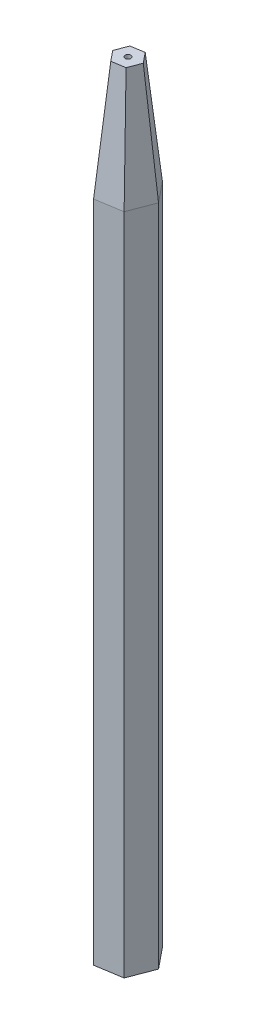
ISO-10303-21;
HEADER;
FILE_DESCRIPTION(('STEP AP214'),'2;1');
FILE_NAME('part.step','',(''),(''),'','','');
FILE_SCHEMA(('AUTOMOTIVE_DESIGN { 1 0 10303 214 1 1 1 1 }'));
ENDSEC;
DATA;
#1=APPLICATION_CONTEXT('core data for automotive mechanical design processes');
#2=APPLICATION_PROTOCOL_DEFINITION('international standard','automotive_design',2000,#1);
#3=PRODUCT_CONTEXT('',#1,'mechanical');
#4=PRODUCT('Part','Part','',(#3));
#5=PRODUCT_RELATED_PRODUCT_CATEGORY('part','',(#4));
#6=PRODUCT_DEFINITION_FORMATION('','',#4);
#7=PRODUCT_DEFINITION_CONTEXT('part definition',#1,'design');
#8=PRODUCT_DEFINITION('design','',#6,#7);
#9=PRODUCT_DEFINITION_SHAPE('','',#8);
#10=(LENGTH_UNIT() NAMED_UNIT(*) SI_UNIT(.MILLI.,.METRE.));
#11=(NAMED_UNIT(*) PLANE_ANGLE_UNIT() SI_UNIT($,.RADIAN.));
#12=(NAMED_UNIT(*) SI_UNIT($,.STERADIAN.) SOLID_ANGLE_UNIT());
#13=UNCERTAINTY_MEASURE_WITH_UNIT(LENGTH_MEASURE(1.E-05),#10,'distance_accuracy_value','');
#14=(GEOMETRIC_REPRESENTATION_CONTEXT(3) GLOBAL_UNCERTAINTY_ASSIGNED_CONTEXT((#13)) GLOBAL_UNIT_ASSIGNED_CONTEXT((#10,
#11,#12)) REPRESENTATION_CONTEXT('',''));
#15=CARTESIAN_POINT('',(0.,0.,0.));
#16=DIRECTION('',(0.,0.,1.));
#17=DIRECTION('',(1.,0.,0.));
#18=AXIS2_PLACEMENT_3D('',#15,#16,#17);
#19=CARTESIAN_POINT('',(0.,135.,0.));
#20=DIRECTION('',(0.,1.,0.));
#21=DIRECTION('',(0.,0.,1.));
#22=AXIS2_PLACEMENT_3D('',#19,#20,#21);
#23=PLANE('',#22);
#24=DIRECTION('',(-0.356838127786204,0.,0.93416623282906));
#25=VECTOR('',#24,1.);
#26=CARTESIAN_POINT('',(-2.69241482219606,135.,1.44368824839446));
#27=LINE('',#26,#25);
#28=CARTESIAN_POINT('',(-1.45629128738914,135.,-1.79235850755584));
#29=VERTEX_POINT('',#28);
#30=CARTESIAN_POINT('',(-2.28037364392709,135.,0.365005996411023));
#31=VERTEX_POINT('',#30);
#32=EDGE_CURVE('E163',#29,#31,#27,.T.);
#33=ORIENTED_EDGE('',*,*,#32,.T.);
#34=DIRECTION('',(0.630592625094472,0.,0.77611400011626));
#35=VECTOR('',#34,1.);
#36=CARTESIAN_POINT('',(-0.0959367128433723,135.,3.05354375774478));
#37=LINE('',#36,#35);
#38=CARTESIAN_POINT('',(-0.824082356537946,135.,2.15736450396686));
#39=VERTEX_POINT('',#38);
#40=EDGE_CURVE('E165',#31,#39,#37,.T.);
#41=ORIENTED_EDGE('',*,*,#40,.T.);
#42=DIRECTION('',(0.987430752880676,0.,-0.158052232712799));
#43=VECTOR('',#42,1.);
#44=CARTESIAN_POINT('',(2.59647810935269,135.,1.60985550935033));
#45=LINE('',#44,#43);
#46=CARTESIAN_POINT('',(1.45629128738914,135.,1.79235850755584));
#47=VERTEX_POINT('',#46);
#48=EDGE_CURVE('E115',#39,#47,#45,.T.);
#49=ORIENTED_EDGE('',*,*,#48,.T.);
#50=DIRECTION('',(0.356838127786204,0.,-0.93416623282906));
#51=VECTOR('',#50,1.);
#52=CARTESIAN_POINT('',(2.69241482219606,135.,-1.44368824839446));
#53=LINE('',#52,#51);
#54=CARTESIAN_POINT('',(2.28037364392709,135.,-0.365005996411024));
#55=VERTEX_POINT('',#54);
#56=EDGE_CURVE('E157',#47,#55,#53,.T.);
#57=ORIENTED_EDGE('',*,*,#56,.T.);
#58=DIRECTION('',(-0.630592625094472,0.,-0.77611400011626));
#59=VECTOR('',#58,1.);
#60=CARTESIAN_POINT('',(0.0959367128433741,135.,-3.05354375774478));
#61=LINE('',#60,#59);
#62=CARTESIAN_POINT('',(0.824082356537947,135.,-2.15736450396686));
#63=VERTEX_POINT('',#62);
#64=EDGE_CURVE('E159',#55,#63,#61,.T.);
#65=ORIENTED_EDGE('',*,*,#64,.T.);
#66=DIRECTION('',(-0.987430752880676,0.,0.158052232712799));
#67=VECTOR('',#66,1.);
#68=CARTESIAN_POINT('',(-2.59647810935269,135.,-1.60985550935033));
#69=LINE('',#68,#67);
#70=EDGE_CURVE('E161',#63,#29,#69,.T.);
#71=ORIENTED_EDGE('',*,*,#70,.T.);
#72=EDGE_LOOP('',(#33,#41,#49,#57,#65,#71));
#73=FACE_BOUND('',#72,.T.);
#74=CARTESIAN_POINT('',(0.,135.,0.));
#75=DIRECTION('',(0.,1.,0.));
#76=DIRECTION('',(0.,0.,1.));
#77=AXIS2_PLACEMENT_3D('',#74,#75,#76);
#78=CIRCLE('',#77,0.5);
#79=CARTESIAN_POINT('',(0.,135.,0.5));
#80=VERTEX_POINT('',#79);
#81=EDGE_CURVE('E132',#80,#80,#78,.T.);
#82=ORIENTED_EDGE('',*,*,#81,.F.);
#83=EDGE_LOOP('',(#82));
#84=FACE_BOUND('',#83,.T.);
#85=ADVANCED_FACE('F36',(#73,#84),#23,.T.);
#86=CARTESIAN_POINT('',(0.,0.,0.));
#87=DIRECTION('',(0.,1.,0.));
#88=DIRECTION('',(0.,0.,1.));
#89=AXIS2_PLACEMENT_3D('',#86,#87,#88);
#90=PLANE('',#89);
#91=DIRECTION('',(0.987430752880676,0.,-0.158052232712799));
#92=VECTOR('',#91,1.);
#93=CARTESIAN_POINT('',(-1.64816471307589,0.,4.31472900793373));
#94=LINE('',#93,#92);
#95=CARTESIAN_POINT('',(-1.64816471307589,0.,4.31472900793373));
#96=VERTEX_POINT('',#95);
#97=CARTESIAN_POINT('',(2.91258257477829,0.,3.58471701511168));
#98=VERTEX_POINT('',#97);
#99=EDGE_CURVE('E123',#96,#98,#94,.T.);
#100=ORIENTED_EDGE('',*,*,#99,.F.);
#101=DIRECTION('',(0.630592625094472,0.,0.77611400011626));
#102=VECTOR('',#101,1.);
#103=CARTESIAN_POINT('',(-4.56074728785418,0.,0.730011992822048));
#104=LINE('',#103,#102);
#105=CARTESIAN_POINT('',(-4.56074728785418,0.,0.730011992822048));
#106=VERTEX_POINT('',#105);
#107=EDGE_CURVE('E146',#106,#96,#104,.T.);
#108=ORIENTED_EDGE('',*,*,#107,.F.);
#109=DIRECTION('',(-0.356838127786204,0.,0.93416623282906));
#110=VECTOR('',#109,1.);
#111=CARTESIAN_POINT('',(-2.91258257477829,0.,-3.58471701511168));
#112=LINE('',#111,#110);
#113=CARTESIAN_POINT('',(-2.91258257477829,0.,-3.58471701511168));
#114=VERTEX_POINT('',#113);
#115=EDGE_CURVE('E143',#114,#106,#112,.T.);
#116=ORIENTED_EDGE('',*,*,#115,.F.);
#117=DIRECTION('',(-0.987430752880676,0.,0.158052232712799));
#118=VECTOR('',#117,1.);
#119=CARTESIAN_POINT('',(1.6481647130759,0.,-4.31472900793373));
#120=LINE('',#119,#118);
#121=CARTESIAN_POINT('',(1.6481647130759,0.,-4.31472900793373));
#122=VERTEX_POINT('',#121);
#123=EDGE_CURVE('E140',#122,#114,#120,.T.);
#124=ORIENTED_EDGE('',*,*,#123,.F.);
#125=DIRECTION('',(-0.630592625094472,0.,-0.77611400011626));
#126=VECTOR('',#125,1.);
#127=CARTESIAN_POINT('',(4.56074728785418,0.,-0.730011992822049));
#128=LINE('',#127,#126);
#129=CARTESIAN_POINT('',(4.56074728785418,0.,-0.730011992822049));
#130=VERTEX_POINT('',#129);
#131=EDGE_CURVE('E126',#130,#122,#128,.T.);
#132=ORIENTED_EDGE('',*,*,#131,.F.);
#133=DIRECTION('',(0.356838127786204,0.,-0.93416623282906));
#134=VECTOR('',#133,1.);
#135=CARTESIAN_POINT('',(2.91258257477829,0.,3.58471701511168));
#136=LINE('',#135,#134);
#137=EDGE_CURVE('E110',#98,#130,#136,.T.);
#138=ORIENTED_EDGE('',*,*,#137,.F.);
#139=EDGE_LOOP('',(#100,#108,#116,#124,#132,#138));
#140=FACE_BOUND('',#139,.T.);
#141=CARTESIAN_POINT('',(0.,0.,0.));
#142=DIRECTION('',(0.,1.,0.));
#143=DIRECTION('',(0.,0.,1.));
#144=AXIS2_PLACEMENT_3D('',#141,#142,#143);
#145=CIRCLE('',#144,0.5);
#146=CARTESIAN_POINT('',(0.,0.,0.5));
#147=VERTEX_POINT('',#146);
#148=EDGE_CURVE('E135',#147,#147,#145,.T.);
#149=ORIENTED_EDGE('',*,*,#148,.T.);
#150=EDGE_LOOP('',(#149));
#151=FACE_BOUND('',#150,.T.);
#152=ADVANCED_FACE('F120',(#140,#151),#90,.F.);
#153=CARTESIAN_POINT('',(-1.64816471307589,135.,4.31472900793373));
#154=DIRECTION('',(-0.158052232712799,0.,-0.987430752880676));
#155=DIRECTION('',(-0.987430752880676,0.,0.158052232712799));
#156=AXIS2_PLACEMENT_3D('',#153,#154,#155);
#157=PLANE('',#156);
#158=DIRECTION('',(0.,-1.,0.));
#159=VECTOR('',#158,1.);
#160=CARTESIAN_POINT('',(2.91258257477829,135.,3.58471701511168));
#161=LINE('',#160,#159);
#162=CARTESIAN_POINT('',(2.91258257477829,114.999999999999,3.58471701511168));
#163=VERTEX_POINT('',#162);
#164=EDGE_CURVE('E107',#163,#98,#161,.T.);
#165=ORIENTED_EDGE('',*,*,#164,.F.);
#166=DIRECTION('',(-0.987430752880676,0.,0.158052232712799));
#167=VECTOR('',#166,1.);
#168=CARTESIAN_POINT('',(-1.64816471307589,114.999999999999,4.31472900793373));
#169=LINE('',#168,#167);
#170=CARTESIAN_POINT('',(-1.64816471307589,114.999999999999,4.31472900793373));
#171=VERTEX_POINT('',#170);
#172=EDGE_CURVE('E11',#163,#171,#169,.T.);
#173=ORIENTED_EDGE('',*,*,#172,.T.);
#174=DIRECTION('',(0.,-1.,0.));
#175=VECTOR('',#174,1.);
#176=CARTESIAN_POINT('',(-1.64816471307589,135.,4.31472900793373));
#177=LINE('',#176,#175);
#178=EDGE_CURVE('E130',#171,#96,#177,.T.);
#179=ORIENTED_EDGE('',*,*,#178,.T.);
#180=ORIENTED_EDGE('',*,*,#99,.T.);
#181=EDGE_LOOP('',(#165,#173,#179,#180));
#182=FACE_BOUND('',#181,.T.);
#183=ADVANCED_FACE('F128',(#182),#157,.F.);
#184=CARTESIAN_POINT('',(2.91258257477829,135.,3.58471701511168));
#185=DIRECTION('',(-0.93416623282906,0.,-0.356838127786204));
#186=DIRECTION('',(-0.356838127786204,0.,0.93416623282906));
#187=AXIS2_PLACEMENT_3D('',#184,#185,#186);
#188=PLANE('',#187);
#189=DIRECTION('',(0.,-1.,0.));
#190=VECTOR('',#189,1.);
#191=CARTESIAN_POINT('',(4.56074728785418,135.,-0.730011992822049));
#192=LINE('',#191,#190);
#193=CARTESIAN_POINT('',(4.56074728785418,114.999999999999,-0.730011992822049));
#194=VERTEX_POINT('',#193);
#195=EDGE_CURVE('E116',#194,#130,#192,.T.);
#196=ORIENTED_EDGE('',*,*,#195,.F.);
#197=DIRECTION('',(-0.356838127786204,0.,0.93416623282906));
#198=VECTOR('',#197,1.);
#199=CARTESIAN_POINT('',(2.91258257477829,114.999999999999,3.58471701511168));
#200=LINE('',#199,#198);
#201=EDGE_CURVE('E46',#194,#163,#200,.T.);
#202=ORIENTED_EDGE('',*,*,#201,.T.);
#203=ORIENTED_EDGE('',*,*,#164,.T.);
#204=ORIENTED_EDGE('',*,*,#137,.T.);
#205=EDGE_LOOP('',(#196,#202,#203,#204));
#206=FACE_BOUND('',#205,.T.);
#207=ADVANCED_FACE('F109',(#206),#188,.F.);
#208=CARTESIAN_POINT('',(4.56074728785418,135.,-0.730011992822049));
#209=DIRECTION('',(-0.77611400011626,0.,0.630592625094472));
#210=DIRECTION('',(0.630592625094472,0.,0.77611400011626));
#211=AXIS2_PLACEMENT_3D('',#208,#209,#210);
#212=PLANE('',#211);
#213=DIRECTION('',(0.,-1.,0.));
#214=VECTOR('',#213,1.);
#215=CARTESIAN_POINT('',(1.6481647130759,135.,-4.31472900793373));
#216=LINE('',#215,#214);
#217=CARTESIAN_POINT('',(1.6481647130759,114.999999999999,-4.31472900793373));
#218=VERTEX_POINT('',#217);
#219=EDGE_CURVE('E153',#218,#122,#216,.T.);
#220=ORIENTED_EDGE('',*,*,#219,.F.);
#221=DIRECTION('',(0.630592625094472,0.,0.77611400011626));
#222=VECTOR('',#221,1.);
#223=CARTESIAN_POINT('',(4.56074728785418,114.999999999999,-0.730011992822049));
#224=LINE('',#223,#222);
#225=EDGE_CURVE('E61',#218,#194,#224,.T.);
#226=ORIENTED_EDGE('',*,*,#225,.T.);
#227=ORIENTED_EDGE('',*,*,#195,.T.);
#228=ORIENTED_EDGE('',*,*,#131,.T.);
#229=EDGE_LOOP('',(#220,#226,#227,#228));
#230=FACE_BOUND('',#229,.T.);
#231=ADVANCED_FACE('F228',(#230),#212,.F.);
#232=CARTESIAN_POINT('',(1.6481647130759,135.,-4.31472900793373));
#233=DIRECTION('',(0.158052232712799,0.,0.987430752880676));
#234=DIRECTION('',(0.987430752880676,0.,-0.158052232712799));
#235=AXIS2_PLACEMENT_3D('',#232,#233,#234);
#236=PLANE('',#235);
#237=DIRECTION('',(0.,-1.,0.));
#238=VECTOR('',#237,1.);
#239=CARTESIAN_POINT('',(-2.91258257477829,135.,-3.58471701511168));
#240=LINE('',#239,#238);
#241=CARTESIAN_POINT('',(-2.91258257477829,114.999999999999,-3.58471701511168));
#242=VERTEX_POINT('',#241);
#243=EDGE_CURVE('E151',#242,#114,#240,.T.);
#244=ORIENTED_EDGE('',*,*,#243,.F.);
#245=DIRECTION('',(0.987430752880676,0.,-0.158052232712799));
#246=VECTOR('',#245,1.);
#247=CARTESIAN_POINT('',(1.6481647130759,114.999999999999,-4.31472900793373));
#248=LINE('',#247,#246);
#249=EDGE_CURVE('E173',#242,#218,#248,.T.);
#250=ORIENTED_EDGE('',*,*,#249,.T.);
#251=ORIENTED_EDGE('',*,*,#219,.T.);
#252=ORIENTED_EDGE('',*,*,#123,.T.);
#253=EDGE_LOOP('',(#244,#250,#251,#252));
#254=FACE_BOUND('',#253,.T.);
#255=ADVANCED_FACE('F224',(#254),#236,.F.);
#256=CARTESIAN_POINT('',(-2.91258257477829,135.,-3.58471701511168));
#257=DIRECTION('',(0.93416623282906,0.,0.356838127786204));
#258=DIRECTION('',(0.356838127786204,0.,-0.93416623282906));
#259=AXIS2_PLACEMENT_3D('',#256,#257,#258);
#260=PLANE('',#259);
#261=DIRECTION('',(0.,-1.,0.));
#262=VECTOR('',#261,1.);
#263=CARTESIAN_POINT('',(-4.56074728785418,135.,0.730011992822048));
#264=LINE('',#263,#262);
#265=CARTESIAN_POINT('',(-4.56074728785418,114.999999999999,0.730011992822048));
#266=VERTEX_POINT('',#265);
#267=EDGE_CURVE('E149',#266,#106,#264,.T.);
#268=ORIENTED_EDGE('',*,*,#267,.F.);
#269=DIRECTION('',(0.356838127786204,0.,-0.93416623282906));
#270=VECTOR('',#269,1.);
#271=CARTESIAN_POINT('',(-2.91258257477829,114.999999999999,-3.58471701511168));
#272=LINE('',#271,#270);
#273=EDGE_CURVE('E171',#266,#242,#272,.T.);
#274=ORIENTED_EDGE('',*,*,#273,.T.);
#275=ORIENTED_EDGE('',*,*,#243,.T.);
#276=ORIENTED_EDGE('',*,*,#115,.T.);
#277=EDGE_LOOP('',(#268,#274,#275,#276));
#278=FACE_BOUND('',#277,.T.);
#279=ADVANCED_FACE('F210',(#278),#260,.F.);
#280=CARTESIAN_POINT('',(-4.56074728785418,135.,0.730011992822048));
#281=DIRECTION('',(0.77611400011626,0.,-0.630592625094472));
#282=DIRECTION('',(-0.630592625094472,0.,-0.77611400011626));
#283=AXIS2_PLACEMENT_3D('',#280,#281,#282);
#284=PLANE('',#283);
#285=ORIENTED_EDGE('',*,*,#178,.F.);
#286=DIRECTION('',(-0.630592625094472,0.,-0.77611400011626));
#287=VECTOR('',#286,1.);
#288=CARTESIAN_POINT('',(-4.56074728785418,114.999999999999,0.730011992822048));
#289=LINE('',#288,#287);
#290=EDGE_CURVE('E168',#171,#266,#289,.T.);
#291=ORIENTED_EDGE('',*,*,#290,.T.);
#292=ORIENTED_EDGE('',*,*,#267,.T.);
#293=ORIENTED_EDGE('',*,*,#107,.T.);
#294=EDGE_LOOP('',(#285,#291,#292,#293));
#295=FACE_BOUND('',#294,.T.);
#296=ADVANCED_FACE('F201',(#295),#284,.F.);
#297=CARTESIAN_POINT('',(0.,135.,0.));
#298=DIRECTION('',(0.,-1.,0.));
#299=DIRECTION('',(0.,0.,-1.));
#300=AXIS2_PLACEMENT_3D('',#297,#298,#299);
#301=CYLINDRICAL_SURFACE('',#300,0.5);
#302=ORIENTED_EDGE('',*,*,#81,.T.);
#303=EDGE_LOOP('',(#302));
#304=FACE_BOUND('',#303,.T.);
#305=ORIENTED_EDGE('',*,*,#148,.F.);
#306=EDGE_LOOP('',(#305));
#307=FACE_BOUND('',#306,.T.);
#308=ADVANCED_FACE('F199',(#304,#307),#301,.F.);
#309=CARTESIAN_POINT('',(1.55222800023252,135.,-1.26118525018894));
#310=DIRECTION('',(0.772262293958319,0.0995037190209956,-0.627463113841145));
#311=DIRECTION('',(0.630592625094472,0.,0.77611400011626));
#312=AXIS2_PLACEMENT_3D('',#309,#310,#311);
#313=PLANE('',#312);
#314=DIRECTION('',(-0.113266075409237,0.993399267798783,0.0181298344788433));
#315=VECTOR('',#314,1.);
#316=CARTESIAN_POINT('',(2.27287241483523,135.065789473684,-0.363805318791251));
#317=LINE('',#316,#315);
#318=EDGE_CURVE('E186',#194,#55,#317,.T.);
#319=ORIENTED_EDGE('',*,*,#318,.F.);
#320=ORIENTED_EDGE('',*,*,#225,.F.);
#321=DIRECTION('',(-0.0409321404795333,0.993399267798783,0.107156215930785));
#322=VECTOR('',#321,1.);
#323=CARTESIAN_POINT('',(0.821371559312494,135.065789473684,-2.15026791020381));
#324=LINE('',#323,#322);
#325=EDGE_CURVE('E41',#63,#218,#324,.F.);
#326=ORIENTED_EDGE('',*,*,#325,.F.);
#327=ORIENTED_EDGE('',*,*,#64,.F.);
#328=EDGE_LOOP('',(#319,#320,#326,#327));
#329=FACE_BOUND('',#328,.T.);
#330=ADVANCED_FACE('F39',(#329),#313,.T.);
#331=CARTESIAN_POINT('',(-0.316104465425598,135.,-1.97486150576135));
#332=DIRECTION('',(-0.157267849544959,0.0995037190209956,-0.982530321873323));
#333=DIRECTION('',(0.987430752880676,0.,-0.158052232712799));
#334=AXIS2_PLACEMENT_3D('',#331,#332,#333);
#335=PLANE('',#334);
#336=ORIENTED_EDGE('',*,*,#325,.T.);
#337=ORIENTED_EDGE('',*,*,#249,.F.);
#338=DIRECTION('',(0.0723339349297038,0.993399267798783,0.0890263814519416));
#339=VECTOR('',#338,1.);
#340=CARTESIAN_POINT('',(-1.45150085552273,135.065789473684,-1.78646259141256));
#341=LINE('',#340,#339);
#342=EDGE_CURVE('E184',#29,#242,#341,.F.);
#343=ORIENTED_EDGE('',*,*,#342,.F.);
#344=ORIENTED_EDGE('',*,*,#70,.F.);
#345=EDGE_LOOP('',(#336,#337,#343,#344));
#346=FACE_BOUND('',#345,.T.);
#347=ADVANCED_FACE('F208',(#346),#335,.T.);
#348=CARTESIAN_POINT('',(1.86833246565812,135.,0.713676255572407));
#349=DIRECTION('',(0.929530143503278,0.0995037190209955,0.355067208032177));
#350=DIRECTION('',(-0.356838127786204,0.,0.93416623282906));
#351=AXIS2_PLACEMENT_3D('',#348,#349,#350);
#352=PLANE('',#351);
#353=ORIENTED_EDGE('',*,*,#318,.T.);
#354=ORIENTED_EDGE('',*,*,#56,.F.);
#355=DIRECTION('',(-0.0723339349297037,0.993399267798783,-0.0890263814519416));
#356=VECTOR('',#355,1.);
#357=CARTESIAN_POINT('',(1.45150085552273,135.065789473684,1.78646259141256));
#358=LINE('',#357,#356);
#359=EDGE_CURVE('E181',#163,#47,#358,.T.);
#360=ORIENTED_EDGE('',*,*,#359,.F.);
#361=ORIENTED_EDGE('',*,*,#201,.F.);
#362=EDGE_LOOP('',(#353,#354,#360,#361));
#363=FACE_BOUND('',#362,.T.);
#364=ADVANCED_FACE('F257',(#363),#352,.T.);
#365=CARTESIAN_POINT('',(-1.86833246565812,135.,-0.713676255572407));
#366=DIRECTION('',(-0.929530143503278,0.0995037190209956,-0.355067208032178));
#367=DIRECTION('',(0.356838127786204,0.,-0.93416623282906));
#368=AXIS2_PLACEMENT_3D('',#365,#366,#367);
#369=PLANE('',#368);
#370=ORIENTED_EDGE('',*,*,#342,.T.);
#371=ORIENTED_EDGE('',*,*,#273,.F.);
#372=DIRECTION('',(0.113266075409237,0.993399267798783,-0.0181298344788432));
#373=VECTOR('',#372,1.);
#374=CARTESIAN_POINT('',(-2.27287241483522,135.065789473684,0.36380531879125));
#375=LINE('',#374,#373);
#376=EDGE_CURVE('E179',#31,#266,#375,.F.);
#377=ORIENTED_EDGE('',*,*,#376,.F.);
#378=ORIENTED_EDGE('',*,*,#32,.F.);
#379=EDGE_LOOP('',(#370,#371,#377,#378));
#380=FACE_BOUND('',#379,.T.);
#381=ADVANCED_FACE('F250',(#380),#369,.T.);
#382=CARTESIAN_POINT('',(0.316104465425598,135.,1.97486150576135));
#383=DIRECTION('',(0.157267849544959,0.0995037190209956,0.982530321873323));
#384=DIRECTION('',(-0.987430752880676,0.,0.158052232712799));
#385=AXIS2_PLACEMENT_3D('',#382,#383,#384);
#386=PLANE('',#385);
#387=ORIENTED_EDGE('',*,*,#359,.T.);
#388=ORIENTED_EDGE('',*,*,#48,.F.);
#389=DIRECTION('',(-0.0409321404795333,-0.993399267798783,0.107156215930785));
#390=VECTOR('',#389,1.);
#391=CARTESIAN_POINT('',(-0.821371559312492,135.065789473684,2.15026791020381));
#392=LINE('',#391,#390);
#393=EDGE_CURVE('E177',#171,#39,#392,.F.);
#394=ORIENTED_EDGE('',*,*,#393,.F.);
#395=ORIENTED_EDGE('',*,*,#172,.F.);
#396=EDGE_LOOP('',(#387,#388,#394,#395));
#397=FACE_BOUND('',#396,.T.);
#398=ADVANCED_FACE('F243',(#397),#386,.T.);
#399=CARTESIAN_POINT('',(-1.55222800023252,135.,1.26118525018894));
#400=DIRECTION('',(-0.772262293958319,0.0995037190209956,0.627463113841145));
#401=DIRECTION('',(-0.630592625094472,0.,-0.77611400011626));
#402=AXIS2_PLACEMENT_3D('',#399,#400,#401);
#403=PLANE('',#402);
#404=ORIENTED_EDGE('',*,*,#376,.T.);
#405=ORIENTED_EDGE('',*,*,#290,.F.);
#406=ORIENTED_EDGE('',*,*,#393,.T.);
#407=ORIENTED_EDGE('',*,*,#40,.F.);
#408=EDGE_LOOP('',(#404,#405,#406,#407));
#409=FACE_BOUND('',#408,.T.);
#410=ADVANCED_FACE('F237',(#409),#403,.T.);
#411=CLOSED_SHELL('',(#85,#152,#183,#207,#231,#255,#279,#296,#308,#330,#347,#364,#381,#398,#410));
#412=MANIFOLD_SOLID_BREP('B2',#411);
#413=ADVANCED_BREP_SHAPE_REPRESENTATION('',(#18,#412),#14);
#414=SHAPE_DEFINITION_REPRESENTATION(#9,#413);
ENDSEC;
END-ISO-10303-21;
